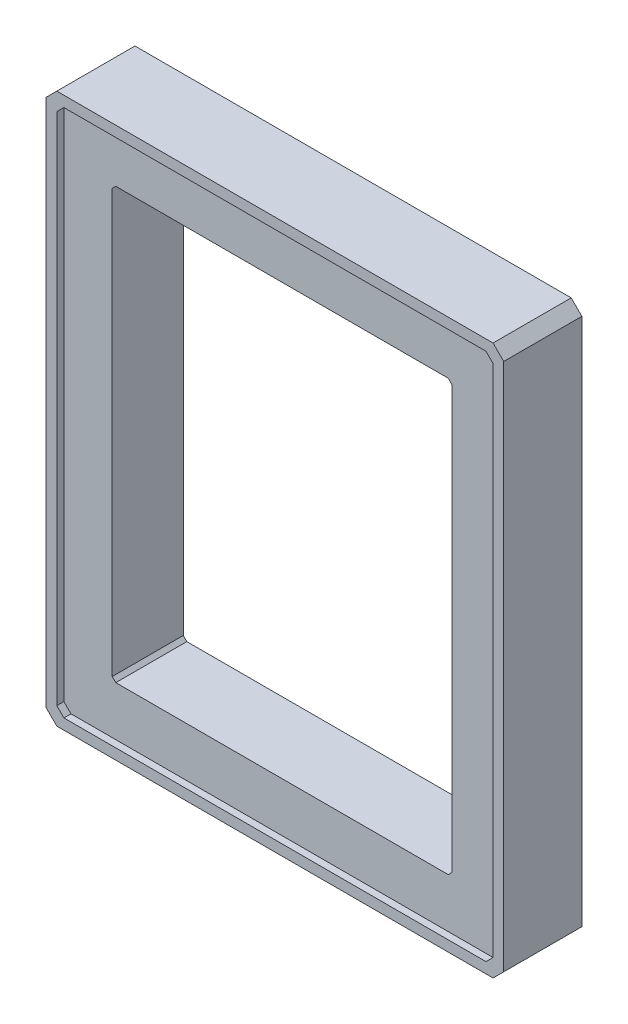
ISO-10303-21;
HEADER;
FILE_DESCRIPTION(('STEP AP214'),'2;1');
FILE_NAME('part.step','',(''),(''),'','','');
FILE_SCHEMA(('AUTOMOTIVE_DESIGN { 1 0 10303 214 1 1 1 1 }'));
ENDSEC;
DATA;
#1=APPLICATION_CONTEXT('core data for automotive mechanical design processes');
#2=APPLICATION_PROTOCOL_DEFINITION('international standard','automotive_design',2000,#1);
#3=PRODUCT_CONTEXT('',#1,'mechanical');
#4=PRODUCT('Part','Part','',(#3));
#5=PRODUCT_RELATED_PRODUCT_CATEGORY('part','',(#4));
#6=PRODUCT_DEFINITION_FORMATION('','',#4);
#7=PRODUCT_DEFINITION_CONTEXT('part definition',#1,'design');
#8=PRODUCT_DEFINITION('design','',#6,#7);
#9=PRODUCT_DEFINITION_SHAPE('','',#8);
#10=(LENGTH_UNIT() NAMED_UNIT(*) SI_UNIT(.MILLI.,.METRE.));
#11=(NAMED_UNIT(*) PLANE_ANGLE_UNIT() SI_UNIT($,.RADIAN.));
#12=(NAMED_UNIT(*) SI_UNIT($,.STERADIAN.) SOLID_ANGLE_UNIT());
#13=UNCERTAINTY_MEASURE_WITH_UNIT(LENGTH_MEASURE(1.E-05),#10,'distance_accuracy_value','');
#14=(GEOMETRIC_REPRESENTATION_CONTEXT(3) GLOBAL_UNCERTAINTY_ASSIGNED_CONTEXT((#13)) GLOBAL_UNIT_ASSIGNED_CONTEXT((#10,
#11,#12)) REPRESENTATION_CONTEXT('',''));
#15=CARTESIAN_POINT('',(0.,0.,0.));
#16=DIRECTION('',(0.,0.,1.));
#17=DIRECTION('',(1.,0.,0.));
#18=AXIS2_PLACEMENT_3D('',#15,#16,#17);
#19=CARTESIAN_POINT('',(0.,0.,20.));
#20=DIRECTION('',(0.,0.,1.));
#21=DIRECTION('',(1.,0.,0.));
#22=AXIS2_PLACEMENT_3D('',#19,#20,#21);
#23=PLANE('',#22);
#24=DIRECTION('',(0.707106781186546,-0.707106781186549,0.));
#25=VECTOR('',#24,1.);
#26=CARTESIAN_POINT('',(-61.4,-72.4,20.));
#27=LINE('',#26,#25);
#28=CARTESIAN_POINT('',(-61.4,-72.4,20.));
#29=VERTEX_POINT('',#28);
#30=CARTESIAN_POINT('',(-59.4,-74.4,20.));
#31=VERTEX_POINT('',#30);
#32=EDGE_CURVE('E58',#29,#31,#27,.T.);
#33=ORIENTED_EDGE('',*,*,#32,.T.);
#34=DIRECTION('',(1.,0.,0.));
#35=VECTOR('',#34,1.);
#36=CARTESIAN_POINT('',(-59.4,-74.4,20.));
#37=LINE('',#36,#35);
#38=CARTESIAN_POINT('',(59.4,-74.4,20.));
#39=VERTEX_POINT('',#38);
#40=EDGE_CURVE('E62',#31,#39,#37,.T.);
#41=ORIENTED_EDGE('',*,*,#40,.T.);
#42=DIRECTION('',(0.707106781186546,0.707106781186549,0.));
#43=VECTOR('',#42,1.);
#44=CARTESIAN_POINT('',(59.4,-74.4,20.));
#45=LINE('',#44,#43);
#46=CARTESIAN_POINT('',(61.4,-72.4,20.));
#47=VERTEX_POINT('',#46);
#48=EDGE_CURVE('E241',#39,#47,#45,.T.);
#49=ORIENTED_EDGE('',*,*,#48,.T.);
#50=DIRECTION('',(0.,1.,0.));
#51=VECTOR('',#50,1.);
#52=CARTESIAN_POINT('',(61.4,-72.4,20.));
#53=LINE('',#52,#51);
#54=CARTESIAN_POINT('',(61.4,72.4,20.));
#55=VERTEX_POINT('',#54);
#56=EDGE_CURVE('E243',#47,#55,#53,.T.);
#57=ORIENTED_EDGE('',*,*,#56,.T.);
#58=DIRECTION('',(-0.707106781186546,0.707106781186549,0.));
#59=VECTOR('',#58,1.);
#60=CARTESIAN_POINT('',(61.4,72.4,20.));
#61=LINE('',#60,#59);
#62=CARTESIAN_POINT('',(59.4,74.4,20.));
#63=VERTEX_POINT('',#62);
#64=EDGE_CURVE('E245',#55,#63,#61,.T.);
#65=ORIENTED_EDGE('',*,*,#64,.T.);
#66=DIRECTION('',(-1.,0.,0.));
#67=VECTOR('',#66,1.);
#68=CARTESIAN_POINT('',(59.4,74.4,20.));
#69=LINE('',#68,#67);
#70=CARTESIAN_POINT('',(-59.4,74.4,20.));
#71=VERTEX_POINT('',#70);
#72=EDGE_CURVE('E247',#63,#71,#69,.T.);
#73=ORIENTED_EDGE('',*,*,#72,.T.);
#74=DIRECTION('',(-0.707106781186546,-0.707106781186549,0.));
#75=VECTOR('',#74,1.);
#76=CARTESIAN_POINT('',(-59.4,74.4,20.));
#77=LINE('',#76,#75);
#78=CARTESIAN_POINT('',(-61.4,72.4,20.));
#79=VERTEX_POINT('',#78);
#80=EDGE_CURVE('E249',#71,#79,#77,.T.);
#81=ORIENTED_EDGE('',*,*,#80,.T.);
#82=DIRECTION('',(0.,-1.,0.));
#83=VECTOR('',#82,1.);
#84=CARTESIAN_POINT('',(-61.4,72.4,20.));
#85=LINE('',#84,#83);
#86=EDGE_CURVE('E213',#79,#29,#85,.T.);
#87=ORIENTED_EDGE('',*,*,#86,.T.);
#88=EDGE_LOOP('',(#33,#41,#49,#57,#65,#73,#81,#87));
#89=FACE_BOUND('',#88,.T.);
#90=DIRECTION('',(1.,0.,0.));
#91=VECTOR('',#90,1.);
#92=CARTESIAN_POINT('',(-46.8,-60.5,20.));
#93=LINE('',#92,#91);
#94=CARTESIAN_POINT('',(-46.8,-60.5,20.));
#95=VERTEX_POINT('',#94);
#96=CARTESIAN_POINT('',(46.8,-60.5,20.));
#97=VERTEX_POINT('',#96);
#98=EDGE_CURVE('E295',#95,#97,#93,.T.);
#99=ORIENTED_EDGE('',*,*,#98,.F.);
#100=DIRECTION('',(0.707106781186547,-0.707106781186547,0.));
#101=VECTOR('',#100,1.);
#102=CARTESIAN_POINT('',(-47.8,-59.5,20.));
#103=LINE('',#102,#101);
#104=CARTESIAN_POINT('',(-47.8,-59.5,20.));
#105=VERTEX_POINT('',#104);
#106=EDGE_CURVE('E293',#105,#95,#103,.T.);
#107=ORIENTED_EDGE('',*,*,#106,.F.);
#108=DIRECTION('',(0.,-1.,0.));
#109=VECTOR('',#108,1.);
#110=CARTESIAN_POINT('',(-47.8,59.5,20.));
#111=LINE('',#110,#109);
#112=CARTESIAN_POINT('',(-47.8,59.5,20.));
#113=VERTEX_POINT('',#112);
#114=EDGE_CURVE('E309',#113,#105,#111,.T.);
#115=ORIENTED_EDGE('',*,*,#114,.F.);
#116=DIRECTION('',(-0.707106781186547,-0.707106781186547,0.));
#117=VECTOR('',#116,1.);
#118=CARTESIAN_POINT('',(-46.8,60.5,20.));
#119=LINE('',#118,#117);
#120=CARTESIAN_POINT('',(-46.8,60.5,20.));
#121=VERTEX_POINT('',#120);
#122=EDGE_CURVE('E306',#121,#113,#119,.T.);
#123=ORIENTED_EDGE('',*,*,#122,.F.);
#124=DIRECTION('',(-1.,0.,0.));
#125=VECTOR('',#124,1.);
#126=CARTESIAN_POINT('',(46.8,60.5,20.));
#127=LINE('',#126,#125);
#128=CARTESIAN_POINT('',(46.8,60.5,20.));
#129=VERTEX_POINT('',#128);
#130=EDGE_CURVE('E304',#129,#121,#127,.T.);
#131=ORIENTED_EDGE('',*,*,#130,.F.);
#132=DIRECTION('',(-0.707106781186547,0.707106781186547,0.));
#133=VECTOR('',#132,1.);
#134=CARTESIAN_POINT('',(47.8,59.5,20.));
#135=LINE('',#134,#133);
#136=CARTESIAN_POINT('',(47.8,59.5,20.));
#137=VERTEX_POINT('',#136);
#138=EDGE_CURVE('E302',#137,#129,#135,.T.);
#139=ORIENTED_EDGE('',*,*,#138,.F.);
#140=DIRECTION('',(0.,1.,0.));
#141=VECTOR('',#140,1.);
#142=CARTESIAN_POINT('',(47.8,-59.5,20.));
#143=LINE('',#142,#141);
#144=CARTESIAN_POINT('',(47.8,-59.5,20.));
#145=VERTEX_POINT('',#144);
#146=EDGE_CURVE('E300',#145,#137,#143,.T.);
#147=ORIENTED_EDGE('',*,*,#146,.F.);
#148=DIRECTION('',(0.707106781186547,0.707106781186547,0.));
#149=VECTOR('',#148,1.);
#150=CARTESIAN_POINT('',(46.8,-60.5,20.));
#151=LINE('',#150,#149);
#152=EDGE_CURVE('E298',#97,#145,#151,.T.);
#153=ORIENTED_EDGE('',*,*,#152,.F.);
#154=EDGE_LOOP('',(#99,#107,#115,#123,#131,#139,#147,#153));
#155=FACE_BOUND('',#154,.T.);
#156=ADVANCED_FACE('F43',(#89,#155),#23,.T.);
#157=CARTESIAN_POINT('',(0.,0.,0.));
#158=DIRECTION('',(0.,0.,1.));
#159=DIRECTION('',(1.,0.,0.));
#160=AXIS2_PLACEMENT_3D('',#157,#158,#159);
#161=PLANE('',#160);
#162=DIRECTION('',(0.707106781186547,-0.707106781186548,0.));
#163=VECTOR('',#162,1.);
#164=CARTESIAN_POINT('',(-64.4,-74.4,0.));
#165=LINE('',#164,#163);
#166=CARTESIAN_POINT('',(-64.4,-74.4,0.));
#167=VERTEX_POINT('',#166);
#168=CARTESIAN_POINT('',(-61.4,-77.4,0.));
#169=VERTEX_POINT('',#168);
#170=EDGE_CURVE('E351',#167,#169,#165,.T.);
#171=ORIENTED_EDGE('',*,*,#170,.F.);
#172=DIRECTION('',(0.,-1.,0.));
#173=VECTOR('',#172,1.);
#174=CARTESIAN_POINT('',(-64.4,74.4,0.));
#175=LINE('',#174,#173);
#176=CARTESIAN_POINT('',(-64.4,74.4,0.));
#177=VERTEX_POINT('',#176);
#178=EDGE_CURVE('E366',#177,#167,#175,.T.);
#179=ORIENTED_EDGE('',*,*,#178,.F.);
#180=DIRECTION('',(-0.707106781186547,-0.707106781186548,0.));
#181=VECTOR('',#180,1.);
#182=CARTESIAN_POINT('',(-61.4,77.4,0.));
#183=LINE('',#182,#181);
#184=CARTESIAN_POINT('',(-61.4,77.4,0.));
#185=VERTEX_POINT('',#184);
#186=EDGE_CURVE('E364',#185,#177,#183,.T.);
#187=ORIENTED_EDGE('',*,*,#186,.F.);
#188=DIRECTION('',(-1.,0.,0.));
#189=VECTOR('',#188,1.);
#190=CARTESIAN_POINT('',(61.4,77.4,0.));
#191=LINE('',#190,#189);
#192=CARTESIAN_POINT('',(61.4,77.4,0.));
#193=VERTEX_POINT('',#192);
#194=EDGE_CURVE('E362',#193,#185,#191,.T.);
#195=ORIENTED_EDGE('',*,*,#194,.F.);
#196=DIRECTION('',(-0.707106781186547,0.707106781186548,0.));
#197=VECTOR('',#196,1.);
#198=CARTESIAN_POINT('',(64.4,74.4,0.));
#199=LINE('',#198,#197);
#200=CARTESIAN_POINT('',(64.4,74.4,0.));
#201=VERTEX_POINT('',#200);
#202=EDGE_CURVE('E360',#201,#193,#199,.T.);
#203=ORIENTED_EDGE('',*,*,#202,.F.);
#204=DIRECTION('',(0.,1.,0.));
#205=VECTOR('',#204,1.);
#206=CARTESIAN_POINT('',(64.4,-74.4,0.));
#207=LINE('',#206,#205);
#208=CARTESIAN_POINT('',(64.4,-74.4,0.));
#209=VERTEX_POINT('',#208);
#210=EDGE_CURVE('E358',#209,#201,#207,.T.);
#211=ORIENTED_EDGE('',*,*,#210,.F.);
#212=DIRECTION('',(0.707106781186547,0.707106781186548,0.));
#213=VECTOR('',#212,1.);
#214=CARTESIAN_POINT('',(61.4,-77.4,0.));
#215=LINE('',#214,#213);
#216=CARTESIAN_POINT('',(61.4,-77.4,0.));
#217=VERTEX_POINT('',#216);
#218=EDGE_CURVE('E356',#217,#209,#215,.T.);
#219=ORIENTED_EDGE('',*,*,#218,.F.);
#220=DIRECTION('',(1.,0.,0.));
#221=VECTOR('',#220,1.);
#222=CARTESIAN_POINT('',(-61.4,-77.4,0.));
#223=LINE('',#222,#221);
#224=EDGE_CURVE('E354',#169,#217,#223,.T.);
#225=ORIENTED_EDGE('',*,*,#224,.F.);
#226=EDGE_LOOP('',(#171,#179,#187,#195,#203,#211,#219,#225));
#227=FACE_BOUND('',#226,.T.);
#228=DIRECTION('',(0.707106781186547,-0.707106781186547,0.));
#229=VECTOR('',#228,1.);
#230=CARTESIAN_POINT('',(-47.8,-59.5,0.));
#231=LINE('',#230,#229);
#232=CARTESIAN_POINT('',(-47.8,-59.5,0.));
#233=VERTEX_POINT('',#232);
#234=CARTESIAN_POINT('',(-46.8,-60.5,0.));
#235=VERTEX_POINT('',#234);
#236=EDGE_CURVE('E292',#233,#235,#231,.T.);
#237=ORIENTED_EDGE('',*,*,#236,.T.);
#238=DIRECTION('',(1.,0.,0.));
#239=VECTOR('',#238,1.);
#240=CARTESIAN_POINT('',(-46.8,-60.5,0.));
#241=LINE('',#240,#239);
#242=CARTESIAN_POINT('',(46.8,-60.5,0.));
#243=VERTEX_POINT('',#242);
#244=EDGE_CURVE('E314',#235,#243,#241,.T.);
#245=ORIENTED_EDGE('',*,*,#244,.T.);
#246=DIRECTION('',(0.707106781186547,0.707106781186547,0.));
#247=VECTOR('',#246,1.);
#248=CARTESIAN_POINT('',(46.8,-60.5,0.));
#249=LINE('',#248,#247);
#250=CARTESIAN_POINT('',(47.8,-59.5,0.));
#251=VERTEX_POINT('',#250);
#252=EDGE_CURVE('E317',#243,#251,#249,.T.);
#253=ORIENTED_EDGE('',*,*,#252,.T.);
#254=DIRECTION('',(0.,1.,0.));
#255=VECTOR('',#254,1.);
#256=CARTESIAN_POINT('',(47.8,-59.5,0.));
#257=LINE('',#256,#255);
#258=CARTESIAN_POINT('',(47.8,59.5,0.));
#259=VERTEX_POINT('',#258);
#260=EDGE_CURVE('E320',#251,#259,#257,.T.);
#261=ORIENTED_EDGE('',*,*,#260,.T.);
#262=DIRECTION('',(-0.707106781186547,0.707106781186547,0.));
#263=VECTOR('',#262,1.);
#264=CARTESIAN_POINT('',(47.8,59.5,0.));
#265=LINE('',#264,#263);
#266=CARTESIAN_POINT('',(46.8,60.5,0.));
#267=VERTEX_POINT('',#266);
#268=EDGE_CURVE('E323',#259,#267,#265,.T.);
#269=ORIENTED_EDGE('',*,*,#268,.T.);
#270=DIRECTION('',(-1.,0.,0.));
#271=VECTOR('',#270,1.);
#272=CARTESIAN_POINT('',(46.8,60.5,0.));
#273=LINE('',#272,#271);
#274=CARTESIAN_POINT('',(-46.8,60.5,0.));
#275=VERTEX_POINT('',#274);
#276=EDGE_CURVE('E326',#267,#275,#273,.T.);
#277=ORIENTED_EDGE('',*,*,#276,.T.);
#278=DIRECTION('',(-0.707106781186547,-0.707106781186547,0.));
#279=VECTOR('',#278,1.);
#280=CARTESIAN_POINT('',(-46.8,60.5,0.));
#281=LINE('',#280,#279);
#282=CARTESIAN_POINT('',(-47.8,59.5,0.));
#283=VERTEX_POINT('',#282);
#284=EDGE_CURVE('E329',#275,#283,#281,.T.);
#285=ORIENTED_EDGE('',*,*,#284,.T.);
#286=DIRECTION('',(0.,-1.,0.));
#287=VECTOR('',#286,1.);
#288=CARTESIAN_POINT('',(-47.8,59.5,0.));
#289=LINE('',#288,#287);
#290=EDGE_CURVE('E296',#283,#233,#289,.T.);
#291=ORIENTED_EDGE('',*,*,#290,.T.);
#292=EDGE_LOOP('',(#237,#245,#253,#261,#269,#277,#285,#291));
#293=FACE_BOUND('',#292,.T.);
#294=ADVANCED_FACE('F395',(#227,#293),#161,.F.);
#295=CARTESIAN_POINT('',(-64.4,-74.4,20.));
#296=DIRECTION('',(0.707106781186548,0.707106781186547,0.));
#297=DIRECTION('',(-0.707106781186547,0.707106781186548,0.));
#298=AXIS2_PLACEMENT_3D('',#295,#296,#297);
#299=PLANE('',#298);
#300=ORIENTED_EDGE('',*,*,#170,.T.);
#301=DIRECTION('',(0.,0.,-1.));
#302=VECTOR('',#301,1.);
#303=CARTESIAN_POINT('',(-61.4,-77.4,20.));
#304=LINE('',#303,#302);
#305=CARTESIAN_POINT('',(-61.4,-77.4,22.));
#306=VERTEX_POINT('',#305);
#307=EDGE_CURVE('E11',#306,#169,#304,.T.);
#308=ORIENTED_EDGE('',*,*,#307,.F.);
#309=DIRECTION('',(0.707106781186547,-0.707106781186548,0.));
#310=VECTOR('',#309,1.);
#311=CARTESIAN_POINT('',(-64.4,-74.4,22.));
#312=LINE('',#311,#310);
#313=CARTESIAN_POINT('',(-64.4,-74.4,22.));
#314=VERTEX_POINT('',#313);
#315=EDGE_CURVE('E218',#314,#306,#312,.T.);
#316=ORIENTED_EDGE('',*,*,#315,.F.);
#317=DIRECTION('',(0.,0.,-1.));
#318=VECTOR('',#317,1.);
#319=CARTESIAN_POINT('',(-64.4,-74.4,20.));
#320=LINE('',#319,#318);
#321=EDGE_CURVE('E368',#314,#167,#320,.T.);
#322=ORIENTED_EDGE('',*,*,#321,.T.);
#323=EDGE_LOOP('',(#300,#308,#316,#322));
#324=FACE_BOUND('',#323,.T.);
#325=ADVANCED_FACE('F45',(#324),#299,.F.);
#326=CARTESIAN_POINT('',(-61.4,-77.4,20.));
#327=DIRECTION('',(0.,1.,0.));
#328=DIRECTION('',(0.,0.,1.));
#329=AXIS2_PLACEMENT_3D('',#326,#327,#328);
#330=PLANE('',#329);
#331=ORIENTED_EDGE('',*,*,#224,.T.);
#332=DIRECTION('',(0.,0.,-1.));
#333=VECTOR('',#332,1.);
#334=CARTESIAN_POINT('',(61.4,-77.4,20.));
#335=LINE('',#334,#333);
#336=CARTESIAN_POINT('',(61.4,-77.4,22.));
#337=VERTEX_POINT('',#336);
#338=EDGE_CURVE('E51',#337,#217,#335,.T.);
#339=ORIENTED_EDGE('',*,*,#338,.F.);
#340=DIRECTION('',(1.,0.,0.));
#341=VECTOR('',#340,1.);
#342=CARTESIAN_POINT('',(-61.4,-77.4,22.));
#343=LINE('',#342,#341);
#344=EDGE_CURVE('E271',#306,#337,#343,.T.);
#345=ORIENTED_EDGE('',*,*,#344,.F.);
#346=ORIENTED_EDGE('',*,*,#307,.T.);
#347=EDGE_LOOP('',(#331,#339,#345,#346));
#348=FACE_BOUND('',#347,.T.);
#349=ADVANCED_FACE('F419',(#348),#330,.F.);
#350=CARTESIAN_POINT('',(61.4,-77.4,20.));
#351=DIRECTION('',(-0.707106781186548,0.707106781186547,0.));
#352=DIRECTION('',(-0.707106781186547,-0.707106781186548,0.));
#353=AXIS2_PLACEMENT_3D('',#350,#351,#352);
#354=PLANE('',#353);
#355=ORIENTED_EDGE('',*,*,#218,.T.);
#356=DIRECTION('',(0.,0.,-1.));
#357=VECTOR('',#356,1.);
#358=CARTESIAN_POINT('',(64.4,-74.4,20.));
#359=LINE('',#358,#357);
#360=CARTESIAN_POINT('',(64.4,-74.4,22.));
#361=VERTEX_POINT('',#360);
#362=EDGE_CURVE('E383',#361,#209,#359,.T.);
#363=ORIENTED_EDGE('',*,*,#362,.F.);
#364=DIRECTION('',(0.707106781186547,0.707106781186548,0.));
#365=VECTOR('',#364,1.);
#366=CARTESIAN_POINT('',(61.4,-77.4,22.));
#367=LINE('',#366,#365);
#368=EDGE_CURVE('E274',#337,#361,#367,.T.);
#369=ORIENTED_EDGE('',*,*,#368,.F.);
#370=ORIENTED_EDGE('',*,*,#338,.T.);
#371=EDGE_LOOP('',(#355,#363,#369,#370));
#372=FACE_BOUND('',#371,.T.);
#373=ADVANCED_FACE('F389',(#372),#354,.F.);
#374=CARTESIAN_POINT('',(64.4,-74.4,20.));
#375=DIRECTION('',(-1.,0.,0.));
#376=DIRECTION('',(0.,0.,1.));
#377=AXIS2_PLACEMENT_3D('',#374,#375,#376);
#378=PLANE('',#377);
#379=ORIENTED_EDGE('',*,*,#210,.T.);
#380=DIRECTION('',(0.,0.,-1.));
#381=VECTOR('',#380,1.);
#382=CARTESIAN_POINT('',(64.4,74.4,20.));
#383=LINE('',#382,#381);
#384=CARTESIAN_POINT('',(64.4,74.4,22.));
#385=VERTEX_POINT('',#384);
#386=EDGE_CURVE('E380',#385,#201,#383,.T.);
#387=ORIENTED_EDGE('',*,*,#386,.F.);
#388=DIRECTION('',(0.,1.,0.));
#389=VECTOR('',#388,1.);
#390=CARTESIAN_POINT('',(64.4,-74.4,22.));
#391=LINE('',#390,#389);
#392=EDGE_CURVE('E277',#361,#385,#391,.T.);
#393=ORIENTED_EDGE('',*,*,#392,.F.);
#394=ORIENTED_EDGE('',*,*,#362,.T.);
#395=EDGE_LOOP('',(#379,#387,#393,#394));
#396=FACE_BOUND('',#395,.T.);
#397=ADVANCED_FACE('F400',(#396),#378,.F.);
#398=CARTESIAN_POINT('',(64.4,74.4,20.));
#399=DIRECTION('',(-0.707106781186548,-0.707106781186547,0.));
#400=DIRECTION('',(0.707106781186547,-0.707106781186548,0.));
#401=AXIS2_PLACEMENT_3D('',#398,#399,#400);
#402=PLANE('',#401);
#403=ORIENTED_EDGE('',*,*,#202,.T.);
#404=DIRECTION('',(0.,0.,-1.));
#405=VECTOR('',#404,1.);
#406=CARTESIAN_POINT('',(61.4,77.4,20.));
#407=LINE('',#406,#405);
#408=CARTESIAN_POINT('',(61.4,77.4,22.));
#409=VERTEX_POINT('',#408);
#410=EDGE_CURVE('E377',#409,#193,#407,.T.);
#411=ORIENTED_EDGE('',*,*,#410,.F.);
#412=DIRECTION('',(-0.707106781186547,0.707106781186548,0.));
#413=VECTOR('',#412,1.);
#414=CARTESIAN_POINT('',(64.4,74.4,22.));
#415=LINE('',#414,#413);
#416=EDGE_CURVE('E280',#385,#409,#415,.T.);
#417=ORIENTED_EDGE('',*,*,#416,.F.);
#418=ORIENTED_EDGE('',*,*,#386,.T.);
#419=EDGE_LOOP('',(#403,#411,#417,#418));
#420=FACE_BOUND('',#419,.T.);
#421=ADVANCED_FACE('F404',(#420),#402,.F.);
#422=CARTESIAN_POINT('',(61.4,77.4,20.));
#423=DIRECTION('',(0.,-1.,0.));
#424=DIRECTION('',(0.,0.,-1.));
#425=AXIS2_PLACEMENT_3D('',#422,#423,#424);
#426=PLANE('',#425);
#427=ORIENTED_EDGE('',*,*,#194,.T.);
#428=DIRECTION('',(0.,0.,-1.));
#429=VECTOR('',#428,1.);
#430=CARTESIAN_POINT('',(-61.4,77.4,20.));
#431=LINE('',#430,#429);
#432=CARTESIAN_POINT('',(-61.4,77.4,22.));
#433=VERTEX_POINT('',#432);
#434=EDGE_CURVE('E374',#433,#185,#431,.T.);
#435=ORIENTED_EDGE('',*,*,#434,.F.);
#436=DIRECTION('',(-1.,0.,0.));
#437=VECTOR('',#436,1.);
#438=CARTESIAN_POINT('',(61.4,77.4,22.));
#439=LINE('',#438,#437);
#440=EDGE_CURVE('E283',#409,#433,#439,.T.);
#441=ORIENTED_EDGE('',*,*,#440,.F.);
#442=ORIENTED_EDGE('',*,*,#410,.T.);
#443=EDGE_LOOP('',(#427,#435,#441,#442));
#444=FACE_BOUND('',#443,.T.);
#445=ADVANCED_FACE('F409',(#444),#426,.F.);
#446=CARTESIAN_POINT('',(-61.4,77.4,20.));
#447=DIRECTION('',(0.707106781186548,-0.707106781186547,0.));
#448=DIRECTION('',(0.707106781186547,0.707106781186548,0.));
#449=AXIS2_PLACEMENT_3D('',#446,#447,#448);
#450=PLANE('',#449);
#451=ORIENTED_EDGE('',*,*,#186,.T.);
#452=DIRECTION('',(0.,0.,-1.));
#453=VECTOR('',#452,1.);
#454=CARTESIAN_POINT('',(-64.4,74.4,20.));
#455=LINE('',#454,#453);
#456=CARTESIAN_POINT('',(-64.4,74.4,22.));
#457=VERTEX_POINT('',#456);
#458=EDGE_CURVE('E371',#457,#177,#455,.T.);
#459=ORIENTED_EDGE('',*,*,#458,.F.);
#460=DIRECTION('',(-0.707106781186547,-0.707106781186548,0.));
#461=VECTOR('',#460,1.);
#462=CARTESIAN_POINT('',(-61.4,77.4,22.));
#463=LINE('',#462,#461);
#464=EDGE_CURVE('E286',#433,#457,#463,.T.);
#465=ORIENTED_EDGE('',*,*,#464,.F.);
#466=ORIENTED_EDGE('',*,*,#434,.T.);
#467=EDGE_LOOP('',(#451,#459,#465,#466));
#468=FACE_BOUND('',#467,.T.);
#469=ADVANCED_FACE('F412',(#468),#450,.F.);
#470=CARTESIAN_POINT('',(-64.4,74.4,20.));
#471=DIRECTION('',(1.,0.,0.));
#472=DIRECTION('',(0.,0.,-1.));
#473=AXIS2_PLACEMENT_3D('',#470,#471,#472);
#474=PLANE('',#473);
#475=ORIENTED_EDGE('',*,*,#178,.T.);
#476=ORIENTED_EDGE('',*,*,#321,.F.);
#477=DIRECTION('',(0.,-1.,0.));
#478=VECTOR('',#477,1.);
#479=CARTESIAN_POINT('',(-64.4,74.4,22.));
#480=LINE('',#479,#478);
#481=EDGE_CURVE('E289',#457,#314,#480,.T.);
#482=ORIENTED_EDGE('',*,*,#481,.F.);
#483=ORIENTED_EDGE('',*,*,#458,.T.);
#484=EDGE_LOOP('',(#475,#476,#482,#483));
#485=FACE_BOUND('',#484,.T.);
#486=ADVANCED_FACE('F415',(#485),#474,.F.);
#487=CARTESIAN_POINT('',(-47.8,-59.5,20.));
#488=DIRECTION('',(0.707106781186548,0.707106781186548,0.));
#489=DIRECTION('',(-0.707106781186548,0.707106781186548,0.));
#490=AXIS2_PLACEMENT_3D('',#487,#488,#489);
#491=PLANE('',#490);
#492=ORIENTED_EDGE('',*,*,#236,.F.);
#493=DIRECTION('',(0.,0.,-1.));
#494=VECTOR('',#493,1.);
#495=CARTESIAN_POINT('',(-47.8,-59.5,20.));
#496=LINE('',#495,#494);
#497=EDGE_CURVE('E311',#105,#233,#496,.T.);
#498=ORIENTED_EDGE('',*,*,#497,.F.);
#499=ORIENTED_EDGE('',*,*,#106,.T.);
#500=DIRECTION('',(0.,0.,-1.));
#501=VECTOR('',#500,1.);
#502=CARTESIAN_POINT('',(-46.8,-60.5,20.));
#503=LINE('',#502,#501);
#504=EDGE_CURVE('E348',#95,#235,#503,.T.);
#505=ORIENTED_EDGE('',*,*,#504,.T.);
#506=EDGE_LOOP('',(#492,#498,#499,#505));
#507=FACE_BOUND('',#506,.T.);
#508=ADVANCED_FACE('F435',(#507),#491,.T.);
#509=CARTESIAN_POINT('',(-46.8,-60.5,20.));
#510=DIRECTION('',(0.,1.,0.));
#511=DIRECTION('',(0.,0.,1.));
#512=AXIS2_PLACEMENT_3D('',#509,#510,#511);
#513=PLANE('',#512);
#514=ORIENTED_EDGE('',*,*,#244,.F.);
#515=ORIENTED_EDGE('',*,*,#504,.F.);
#516=ORIENTED_EDGE('',*,*,#98,.T.);
#517=DIRECTION('',(0.,0.,-1.));
#518=VECTOR('',#517,1.);
#519=CARTESIAN_POINT('',(46.8,-60.5,20.));
#520=LINE('',#519,#518);
#521=EDGE_CURVE('E346',#97,#243,#520,.T.);
#522=ORIENTED_EDGE('',*,*,#521,.T.);
#523=EDGE_LOOP('',(#514,#515,#516,#522));
#524=FACE_BOUND('',#523,.T.);
#525=ADVANCED_FACE('F609',(#524),#513,.T.);
#526=CARTESIAN_POINT('',(46.8,-60.5,20.));
#527=DIRECTION('',(-0.707106781186548,0.707106781186548,0.));
#528=DIRECTION('',(-0.707106781186548,-0.707106781186548,0.));
#529=AXIS2_PLACEMENT_3D('',#526,#527,#528);
#530=PLANE('',#529);
#531=ORIENTED_EDGE('',*,*,#252,.F.);
#532=ORIENTED_EDGE('',*,*,#521,.F.);
#533=ORIENTED_EDGE('',*,*,#152,.T.);
#534=DIRECTION('',(0.,0.,-1.));
#535=VECTOR('',#534,1.);
#536=CARTESIAN_POINT('',(47.8,-59.5,20.));
#537=LINE('',#536,#535);
#538=EDGE_CURVE('E344',#145,#251,#537,.T.);
#539=ORIENTED_EDGE('',*,*,#538,.T.);
#540=EDGE_LOOP('',(#531,#532,#533,#539));
#541=FACE_BOUND('',#540,.T.);
#542=ADVANCED_FACE('F600',(#541),#530,.T.);
#543=CARTESIAN_POINT('',(47.8,-59.5,20.));
#544=DIRECTION('',(-1.,0.,0.));
#545=DIRECTION('',(0.,0.,1.));
#546=AXIS2_PLACEMENT_3D('',#543,#544,#545);
#547=PLANE('',#546);
#548=ORIENTED_EDGE('',*,*,#260,.F.);
#549=ORIENTED_EDGE('',*,*,#538,.F.);
#550=ORIENTED_EDGE('',*,*,#146,.T.);
#551=DIRECTION('',(0.,0.,-1.));
#552=VECTOR('',#551,1.);
#553=CARTESIAN_POINT('',(47.8,59.5,20.));
#554=LINE('',#553,#552);
#555=EDGE_CURVE('E342',#137,#259,#554,.T.);
#556=ORIENTED_EDGE('',*,*,#555,.T.);
#557=EDGE_LOOP('',(#548,#549,#550,#556));
#558=FACE_BOUND('',#557,.T.);
#559=ADVANCED_FACE('F591',(#558),#547,.T.);
#560=CARTESIAN_POINT('',(47.8,59.5,20.));
#561=DIRECTION('',(-0.707106781186548,-0.707106781186548,0.));
#562=DIRECTION('',(0.707106781186548,-0.707106781186548,0.));
#563=AXIS2_PLACEMENT_3D('',#560,#561,#562);
#564=PLANE('',#563);
#565=ORIENTED_EDGE('',*,*,#268,.F.);
#566=ORIENTED_EDGE('',*,*,#555,.F.);
#567=ORIENTED_EDGE('',*,*,#138,.T.);
#568=DIRECTION('',(0.,0.,-1.));
#569=VECTOR('',#568,1.);
#570=CARTESIAN_POINT('',(46.8,60.5,20.));
#571=LINE('',#570,#569);
#572=EDGE_CURVE('E340',#129,#267,#571,.T.);
#573=ORIENTED_EDGE('',*,*,#572,.T.);
#574=EDGE_LOOP('',(#565,#566,#567,#573));
#575=FACE_BOUND('',#574,.T.);
#576=ADVANCED_FACE('F582',(#575),#564,.T.);
#577=CARTESIAN_POINT('',(46.8,60.5,20.));
#578=DIRECTION('',(0.,-1.,0.));
#579=DIRECTION('',(0.,0.,-1.));
#580=AXIS2_PLACEMENT_3D('',#577,#578,#579);
#581=PLANE('',#580);
#582=ORIENTED_EDGE('',*,*,#276,.F.);
#583=ORIENTED_EDGE('',*,*,#572,.F.);
#584=ORIENTED_EDGE('',*,*,#130,.T.);
#585=DIRECTION('',(0.,0.,-1.));
#586=VECTOR('',#585,1.);
#587=CARTESIAN_POINT('',(-46.8,60.5,20.));
#588=LINE('',#587,#586);
#589=EDGE_CURVE('E338',#121,#275,#588,.T.);
#590=ORIENTED_EDGE('',*,*,#589,.T.);
#591=EDGE_LOOP('',(#582,#583,#584,#590));
#592=FACE_BOUND('',#591,.T.);
#593=ADVANCED_FACE('F573',(#592),#581,.T.);
#594=CARTESIAN_POINT('',(-46.8,60.5,20.));
#595=DIRECTION('',(0.707106781186548,-0.707106781186548,0.));
#596=DIRECTION('',(0.707106781186548,0.707106781186548,0.));
#597=AXIS2_PLACEMENT_3D('',#594,#595,#596);
#598=PLANE('',#597);
#599=ORIENTED_EDGE('',*,*,#284,.F.);
#600=ORIENTED_EDGE('',*,*,#589,.F.);
#601=ORIENTED_EDGE('',*,*,#122,.T.);
#602=DIRECTION('',(0.,0.,-1.));
#603=VECTOR('',#602,1.);
#604=CARTESIAN_POINT('',(-47.8,59.5,20.));
#605=LINE('',#604,#603);
#606=EDGE_CURVE('E336',#113,#283,#605,.T.);
#607=ORIENTED_EDGE('',*,*,#606,.T.);
#608=EDGE_LOOP('',(#599,#600,#601,#607));
#609=FACE_BOUND('',#608,.T.);
#610=ADVANCED_FACE('F563',(#609),#598,.T.);
#611=CARTESIAN_POINT('',(-47.8,59.5,20.));
#612=DIRECTION('',(1.,0.,0.));
#613=DIRECTION('',(0.,0.,-1.));
#614=AXIS2_PLACEMENT_3D('',#611,#612,#613);
#615=PLANE('',#614);
#616=ORIENTED_EDGE('',*,*,#290,.F.);
#617=ORIENTED_EDGE('',*,*,#606,.F.);
#618=ORIENTED_EDGE('',*,*,#114,.T.);
#619=ORIENTED_EDGE('',*,*,#497,.T.);
#620=EDGE_LOOP('',(#616,#617,#618,#619));
#621=FACE_BOUND('',#620,.T.);
#622=ADVANCED_FACE('F478',(#621),#615,.T.);
#623=CARTESIAN_POINT('',(0.,0.,22.));
#624=DIRECTION('',(0.,0.,1.));
#625=DIRECTION('',(1.,0.,0.));
#626=AXIS2_PLACEMENT_3D('',#623,#624,#625);
#627=PLANE('',#626);
#628=ORIENTED_EDGE('',*,*,#315,.T.);
#629=ORIENTED_EDGE('',*,*,#344,.T.);
#630=ORIENTED_EDGE('',*,*,#368,.T.);
#631=ORIENTED_EDGE('',*,*,#392,.T.);
#632=ORIENTED_EDGE('',*,*,#416,.T.);
#633=ORIENTED_EDGE('',*,*,#440,.T.);
#634=ORIENTED_EDGE('',*,*,#464,.T.);
#635=ORIENTED_EDGE('',*,*,#481,.T.);
#636=EDGE_LOOP('',(#628,#629,#630,#631,#632,#633,#634,#635));
#637=FACE_BOUND('',#636,.T.);
#638=DIRECTION('',(1.,0.,0.));
#639=VECTOR('',#638,1.);
#640=CARTESIAN_POINT('',(-59.4,-74.4,22.));
#641=LINE('',#640,#639);
#642=CARTESIAN_POINT('',(-59.4,-74.4,22.));
#643=VERTEX_POINT('',#642);
#644=CARTESIAN_POINT('',(59.4,-74.4,22.));
#645=VERTEX_POINT('',#644);
#646=EDGE_CURVE('E212',#643,#645,#641,.T.);
#647=ORIENTED_EDGE('',*,*,#646,.F.);
#648=DIRECTION('',(0.707106781186546,-0.707106781186549,0.));
#649=VECTOR('',#648,1.);
#650=CARTESIAN_POINT('',(-61.4,-72.4,22.));
#651=LINE('',#650,#649);
#652=CARTESIAN_POINT('',(-61.4,-72.4,22.));
#653=VERTEX_POINT('',#652);
#654=EDGE_CURVE('E203',#653,#643,#651,.T.);
#655=ORIENTED_EDGE('',*,*,#654,.F.);
#656=DIRECTION('',(0.,-1.,0.));
#657=VECTOR('',#656,1.);
#658=CARTESIAN_POINT('',(-61.4,72.4,22.));
#659=LINE('',#658,#657);
#660=CARTESIAN_POINT('',(-61.4,72.4,22.));
#661=VERTEX_POINT('',#660);
#662=EDGE_CURVE('E237',#661,#653,#659,.T.);
#663=ORIENTED_EDGE('',*,*,#662,.F.);
#664=DIRECTION('',(-0.707106781186546,-0.707106781186549,0.));
#665=VECTOR('',#664,1.);
#666=CARTESIAN_POINT('',(-59.4,74.4,22.));
#667=LINE('',#666,#665);
#668=CARTESIAN_POINT('',(-59.4,74.4,22.));
#669=VERTEX_POINT('',#668);
#670=EDGE_CURVE('E234',#669,#661,#667,.T.);
#671=ORIENTED_EDGE('',*,*,#670,.F.);
#672=DIRECTION('',(-1.,0.,0.));
#673=VECTOR('',#672,1.);
#674=CARTESIAN_POINT('',(59.4,74.4,22.));
#675=LINE('',#674,#673);
#676=CARTESIAN_POINT('',(59.4,74.4,22.));
#677=VERTEX_POINT('',#676);
#678=EDGE_CURVE('E232',#677,#669,#675,.T.);
#679=ORIENTED_EDGE('',*,*,#678,.F.);
#680=DIRECTION('',(-0.707106781186546,0.707106781186549,0.));
#681=VECTOR('',#680,1.);
#682=CARTESIAN_POINT('',(61.4,72.4,22.));
#683=LINE('',#682,#681);
#684=CARTESIAN_POINT('',(61.4,72.4,22.));
#685=VERTEX_POINT('',#684);
#686=EDGE_CURVE('E230',#685,#677,#683,.T.);
#687=ORIENTED_EDGE('',*,*,#686,.F.);
#688=DIRECTION('',(0.,1.,0.));
#689=VECTOR('',#688,1.);
#690=CARTESIAN_POINT('',(61.4,-72.4,22.));
#691=LINE('',#690,#689);
#692=CARTESIAN_POINT('',(61.4,-72.4,22.));
#693=VERTEX_POINT('',#692);
#694=EDGE_CURVE('E226',#693,#685,#691,.T.);
#695=ORIENTED_EDGE('',*,*,#694,.F.);
#696=DIRECTION('',(0.707106781186546,0.707106781186549,0.));
#697=VECTOR('',#696,1.);
#698=CARTESIAN_POINT('',(59.4,-74.4,22.));
#699=LINE('',#698,#697);
#700=EDGE_CURVE('E224',#645,#693,#699,.T.);
#701=ORIENTED_EDGE('',*,*,#700,.F.);
#702=EDGE_LOOP('',(#647,#655,#663,#671,#679,#687,#695,#701));
#703=FACE_BOUND('',#702,.T.);
#704=ADVANCED_FACE('F222',(#637,#703),#627,.T.);
#705=CARTESIAN_POINT('',(-61.4,-72.4,22.));
#706=DIRECTION('',(0.707106781186549,0.707106781186546,0.));
#707=DIRECTION('',(-0.707106781186546,0.707106781186549,0.));
#708=AXIS2_PLACEMENT_3D('',#705,#706,#707);
#709=PLANE('',#708);
#710=ORIENTED_EDGE('',*,*,#32,.F.);
#711=DIRECTION('',(0.,0.,-1.));
#712=VECTOR('',#711,1.);
#713=CARTESIAN_POINT('',(-61.4,-72.4,22.));
#714=LINE('',#713,#712);
#715=EDGE_CURVE('E208',#653,#29,#714,.T.);
#716=ORIENTED_EDGE('',*,*,#715,.F.);
#717=ORIENTED_EDGE('',*,*,#654,.T.);
#718=DIRECTION('',(0.,0.,-1.));
#719=VECTOR('',#718,1.);
#720=CARTESIAN_POINT('',(-59.4,-74.4,22.));
#721=LINE('',#720,#719);
#722=EDGE_CURVE('E206',#643,#31,#721,.T.);
#723=ORIENTED_EDGE('',*,*,#722,.T.);
#724=EDGE_LOOP('',(#710,#716,#717,#723));
#725=FACE_BOUND('',#724,.T.);
#726=ADVANCED_FACE('F205',(#725),#709,.T.);
#727=CARTESIAN_POINT('',(-59.4,-74.4,22.));
#728=DIRECTION('',(0.,1.,0.));
#729=DIRECTION('',(0.,0.,1.));
#730=AXIS2_PLACEMENT_3D('',#727,#728,#729);
#731=PLANE('',#730);
#732=ORIENTED_EDGE('',*,*,#40,.F.);
#733=ORIENTED_EDGE('',*,*,#722,.F.);
#734=ORIENTED_EDGE('',*,*,#646,.T.);
#735=DIRECTION('',(0.,0.,-1.));
#736=VECTOR('',#735,1.);
#737=CARTESIAN_POINT('',(59.4,-74.4,22.));
#738=LINE('',#737,#736);
#739=EDGE_CURVE('E219',#645,#39,#738,.T.);
#740=ORIENTED_EDGE('',*,*,#739,.T.);
#741=EDGE_LOOP('',(#732,#733,#734,#740));
#742=FACE_BOUND('',#741,.T.);
#743=ADVANCED_FACE('F216',(#742),#731,.T.);
#744=CARTESIAN_POINT('',(59.4,-74.4,22.));
#745=DIRECTION('',(-0.707106781186549,0.707106781186546,0.));
#746=DIRECTION('',(-0.707106781186546,-0.707106781186549,0.));
#747=AXIS2_PLACEMENT_3D('',#744,#745,#746);
#748=PLANE('',#747);
#749=ORIENTED_EDGE('',*,*,#48,.F.);
#750=ORIENTED_EDGE('',*,*,#739,.F.);
#751=ORIENTED_EDGE('',*,*,#700,.T.);
#752=DIRECTION('',(0.,0.,-1.));
#753=VECTOR('',#752,1.);
#754=CARTESIAN_POINT('',(61.4,-72.4,22.));
#755=LINE('',#754,#753);
#756=EDGE_CURVE('E265',#693,#47,#755,.T.);
#757=ORIENTED_EDGE('',*,*,#756,.T.);
#758=EDGE_LOOP('',(#749,#750,#751,#757));
#759=FACE_BOUND('',#758,.T.);
#760=ADVANCED_FACE('F493',(#759),#748,.T.);
#761=CARTESIAN_POINT('',(61.4,-72.4,22.));
#762=DIRECTION('',(-1.,0.,0.));
#763=DIRECTION('',(0.,0.,1.));
#764=AXIS2_PLACEMENT_3D('',#761,#762,#763);
#765=PLANE('',#764);
#766=ORIENTED_EDGE('',*,*,#56,.F.);
#767=ORIENTED_EDGE('',*,*,#756,.F.);
#768=ORIENTED_EDGE('',*,*,#694,.T.);
#769=DIRECTION('',(0.,0.,-1.));
#770=VECTOR('',#769,1.);
#771=CARTESIAN_POINT('',(61.4,72.4,22.));
#772=LINE('',#771,#770);
#773=EDGE_CURVE('E262',#685,#55,#772,.T.);
#774=ORIENTED_EDGE('',*,*,#773,.T.);
#775=EDGE_LOOP('',(#766,#767,#768,#774));
#776=FACE_BOUND('',#775,.T.);
#777=ADVANCED_FACE('F501',(#776),#765,.T.);
#778=CARTESIAN_POINT('',(61.4,72.4,22.));
#779=DIRECTION('',(-0.707106781186549,-0.707106781186546,0.));
#780=DIRECTION('',(0.707106781186546,-0.707106781186549,0.));
#781=AXIS2_PLACEMENT_3D('',#778,#779,#780);
#782=PLANE('',#781);
#783=ORIENTED_EDGE('',*,*,#64,.F.);
#784=ORIENTED_EDGE('',*,*,#773,.F.);
#785=ORIENTED_EDGE('',*,*,#686,.T.);
#786=DIRECTION('',(0.,0.,-1.));
#787=VECTOR('',#786,1.);
#788=CARTESIAN_POINT('',(59.4,74.4,22.));
#789=LINE('',#788,#787);
#790=EDGE_CURVE('E259',#677,#63,#789,.T.);
#791=ORIENTED_EDGE('',*,*,#790,.T.);
#792=EDGE_LOOP('',(#783,#784,#785,#791));
#793=FACE_BOUND('',#792,.T.);
#794=ADVANCED_FACE('F510',(#793),#782,.T.);
#795=CARTESIAN_POINT('',(59.4,74.4,22.));
#796=DIRECTION('',(0.,-1.,0.));
#797=DIRECTION('',(0.,0.,-1.));
#798=AXIS2_PLACEMENT_3D('',#795,#796,#797);
#799=PLANE('',#798);
#800=ORIENTED_EDGE('',*,*,#72,.F.);
#801=ORIENTED_EDGE('',*,*,#790,.F.);
#802=ORIENTED_EDGE('',*,*,#678,.T.);
#803=DIRECTION('',(0.,0.,-1.));
#804=VECTOR('',#803,1.);
#805=CARTESIAN_POINT('',(-59.4,74.4,22.));
#806=LINE('',#805,#804);
#807=EDGE_CURVE('E256',#669,#71,#806,.T.);
#808=ORIENTED_EDGE('',*,*,#807,.T.);
#809=EDGE_LOOP('',(#800,#801,#802,#808));
#810=FACE_BOUND('',#809,.T.);
#811=ADVANCED_FACE('F519',(#810),#799,.T.);
#812=CARTESIAN_POINT('',(-59.4,74.4,22.));
#813=DIRECTION('',(0.707106781186549,-0.707106781186546,0.));
#814=DIRECTION('',(0.707106781186546,0.707106781186549,0.));
#815=AXIS2_PLACEMENT_3D('',#812,#813,#814);
#816=PLANE('',#815);
#817=ORIENTED_EDGE('',*,*,#80,.F.);
#818=ORIENTED_EDGE('',*,*,#807,.F.);
#819=ORIENTED_EDGE('',*,*,#670,.T.);
#820=DIRECTION('',(0.,0.,-1.));
#821=VECTOR('',#820,1.);
#822=CARTESIAN_POINT('',(-61.4,72.4,22.));
#823=LINE('',#822,#821);
#824=EDGE_CURVE('E253',#661,#79,#823,.T.);
#825=ORIENTED_EDGE('',*,*,#824,.T.);
#826=EDGE_LOOP('',(#817,#818,#819,#825));
#827=FACE_BOUND('',#826,.T.);
#828=ADVANCED_FACE('F528',(#827),#816,.T.);
#829=CARTESIAN_POINT('',(-61.4,72.4,22.));
#830=DIRECTION('',(1.,0.,0.));
#831=DIRECTION('',(0.,0.,-1.));
#832=AXIS2_PLACEMENT_3D('',#829,#830,#831);
#833=PLANE('',#832);
#834=ORIENTED_EDGE('',*,*,#86,.F.);
#835=ORIENTED_EDGE('',*,*,#824,.F.);
#836=ORIENTED_EDGE('',*,*,#662,.T.);
#837=ORIENTED_EDGE('',*,*,#715,.T.);
#838=EDGE_LOOP('',(#834,#835,#836,#837));
#839=FACE_BOUND('',#838,.T.);
#840=ADVANCED_FACE('F537',(#839),#833,.T.);
#841=CLOSED_SHELL('',(#156,#294,#325,#349,#373,#397,#421,#445,#469,#486,#508,#525,#542,#559,
#576,#593,#610,#622,#704,#726,#743,#760,#777,#794,#811,#828,#840));
#842=MANIFOLD_SOLID_BREP('B2',#841);
#843=ADVANCED_BREP_SHAPE_REPRESENTATION('',(#18,#842),#14);
#844=SHAPE_DEFINITION_REPRESENTATION(#9,#843);
ENDSEC;
END-ISO-10303-21;
